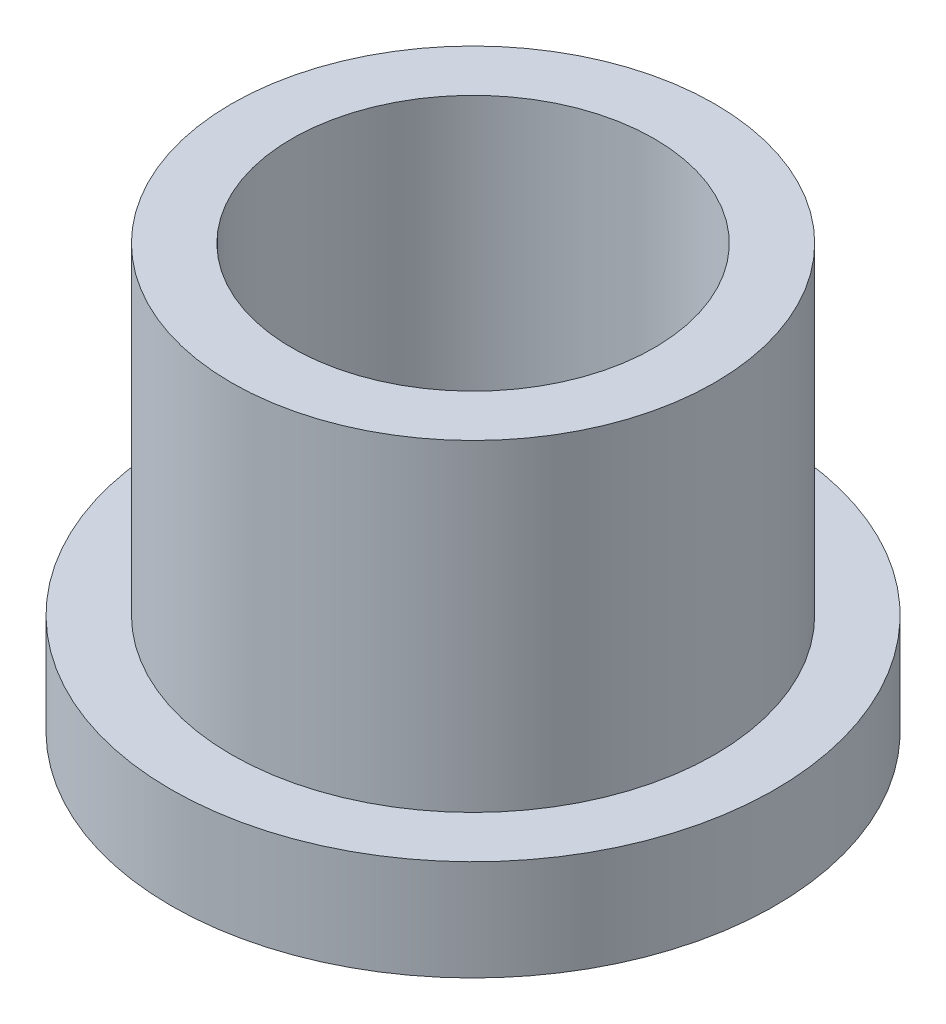
ISO-10303-21;
HEADER;
FILE_DESCRIPTION(('STEP AP214'),'2;1');
FILE_NAME('part.step','',(''),(''),'','','');
FILE_SCHEMA(('AUTOMOTIVE_DESIGN { 1 0 10303 214 1 1 1 1 }'));
ENDSEC;
DATA;
#1=APPLICATION_CONTEXT('core data for automotive mechanical design processes');
#2=APPLICATION_PROTOCOL_DEFINITION('international standard','automotive_design',2000,#1);
#3=PRODUCT_CONTEXT('',#1,'mechanical');
#4=PRODUCT('Part','Part','',(#3));
#5=PRODUCT_RELATED_PRODUCT_CATEGORY('part','',(#4));
#6=PRODUCT_DEFINITION_FORMATION('','',#4);
#7=PRODUCT_DEFINITION_CONTEXT('part definition',#1,'design');
#8=PRODUCT_DEFINITION('design','',#6,#7);
#9=PRODUCT_DEFINITION_SHAPE('','',#8);
#10=(LENGTH_UNIT() NAMED_UNIT(*) SI_UNIT(.MILLI.,.METRE.));
#11=(NAMED_UNIT(*) PLANE_ANGLE_UNIT() SI_UNIT($,.RADIAN.));
#12=(NAMED_UNIT(*) SI_UNIT($,.STERADIAN.) SOLID_ANGLE_UNIT());
#13=UNCERTAINTY_MEASURE_WITH_UNIT(LENGTH_MEASURE(1.E-05),#10,'distance_accuracy_value','');
#14=(GEOMETRIC_REPRESENTATION_CONTEXT(3) GLOBAL_UNCERTAINTY_ASSIGNED_CONTEXT((#13)) GLOBAL_UNIT_ASSIGNED_CONTEXT((#10,
#11,#12)) REPRESENTATION_CONTEXT('',''));
#15=CARTESIAN_POINT('',(0.,0.,0.));
#16=DIRECTION('',(0.,0.,1.));
#17=DIRECTION('',(1.,0.,0.));
#18=AXIS2_PLACEMENT_3D('',#15,#16,#17);
#19=CARTESIAN_POINT('',(0.,5.,0.));
#20=DIRECTION('',(0.,-1.,0.));
#21=DIRECTION('',(0.,0.,-1.));
#22=AXIS2_PLACEMENT_3D('',#19,#20,#21);
#23=CYLINDRICAL_SURFACE('',#22,15.);
#24=CARTESIAN_POINT('',(0.,5.,0.));
#25=DIRECTION('',(0.,1.,0.));
#26=DIRECTION('',(0.,0.,1.));
#27=AXIS2_PLACEMENT_3D('',#24,#25,#26);
#28=CIRCLE('',#27,15.);
#29=CARTESIAN_POINT('',(0.,5.,15.));
#30=VERTEX_POINT('',#29);
#31=EDGE_CURVE('E10',#30,#30,#28,.T.);
#32=ORIENTED_EDGE('',*,*,#31,.F.);
#33=EDGE_LOOP('',(#32));
#34=FACE_BOUND('',#33,.T.);
#35=CARTESIAN_POINT('',(0.,0.,0.));
#36=DIRECTION('',(0.,1.,0.));
#37=DIRECTION('',(0.,0.,1.));
#38=AXIS2_PLACEMENT_3D('',#35,#36,#37);
#39=CIRCLE('',#38,15.);
#40=CARTESIAN_POINT('',(0.,0.,15.));
#41=VERTEX_POINT('',#40);
#42=EDGE_CURVE('E38',#41,#41,#39,.T.);
#43=ORIENTED_EDGE('',*,*,#42,.T.);
#44=EDGE_LOOP('',(#43));
#45=FACE_BOUND('',#44,.T.);
#46=ADVANCED_FACE('F35',(#34,#45),#23,.T.);
#47=CARTESIAN_POINT('',(0.,5.,0.));
#48=DIRECTION('',(0.,1.,0.));
#49=DIRECTION('',(0.,0.,1.));
#50=AXIS2_PLACEMENT_3D('',#47,#48,#49);
#51=PLANE('',#50);
#52=CARTESIAN_POINT('',(0.,5.,0.));
#53=DIRECTION('',(0.,1.,0.));
#54=DIRECTION('',(0.,0.,1.));
#55=AXIS2_PLACEMENT_3D('',#52,#53,#54);
#56=CIRCLE('',#55,12.);
#57=CARTESIAN_POINT('',(0.,5.,-12.));
#58=VERTEX_POINT('',#57);
#59=EDGE_CURVE('E45',#58,#58,#56,.F.);
#60=ORIENTED_EDGE('',*,*,#59,.T.);
#61=EDGE_LOOP('',(#60));
#62=FACE_BOUND('',#61,.T.);
#63=ORIENTED_EDGE('',*,*,#31,.T.);
#64=EDGE_LOOP('',(#63));
#65=FACE_BOUND('',#64,.T.);
#66=ADVANCED_FACE('F76',(#62,#65),#51,.T.);
#67=CARTESIAN_POINT('',(0.,0.,0.));
#68=DIRECTION('',(0.,1.,0.));
#69=DIRECTION('',(0.,0.,1.));
#70=AXIS2_PLACEMENT_3D('',#67,#68,#69);
#71=PLANE('',#70);
#72=CARTESIAN_POINT('',(0.,0.,0.));
#73=DIRECTION('',(0.,1.,0.));
#74=DIRECTION('',(0.,0.,1.));
#75=AXIS2_PLACEMENT_3D('',#72,#73,#74);
#76=CIRCLE('',#75,9.);
#77=CARTESIAN_POINT('',(0.,0.,-9.));
#78=VERTEX_POINT('',#77);
#79=EDGE_CURVE('E53',#78,#78,#76,.T.);
#80=ORIENTED_EDGE('',*,*,#79,.T.);
#81=EDGE_LOOP('',(#80));
#82=FACE_BOUND('',#81,.T.);
#83=ORIENTED_EDGE('',*,*,#42,.F.);
#84=EDGE_LOOP('',(#83));
#85=FACE_BOUND('',#84,.T.);
#86=ADVANCED_FACE('F70',(#82,#85),#71,.F.);
#87=CARTESIAN_POINT('',(0.,21.,0.));
#88=DIRECTION('',(0.,-1.,0.));
#89=DIRECTION('',(0.,0.,-1.));
#90=AXIS2_PLACEMENT_3D('',#87,#88,#89);
#91=CYLINDRICAL_SURFACE('',#90,12.);
#92=CARTESIAN_POINT('',(0.,21.,0.));
#93=DIRECTION('',(0.,1.,0.));
#94=DIRECTION('',(0.,0.,1.));
#95=AXIS2_PLACEMENT_3D('',#92,#93,#94);
#96=CIRCLE('',#95,12.);
#97=CARTESIAN_POINT('',(0.,21.,-12.));
#98=VERTEX_POINT('',#97);
#99=EDGE_CURVE('E49',#98,#98,#96,.T.);
#100=CARTESIAN_POINT('',(0.,5.,-12.));
#101=CARTESIAN_POINT('',(0.,5.16666666666666,-12.));
#102=CARTESIAN_POINT('',(0.,5.33333333333333,-12.));
#103=CARTESIAN_POINT('',(0.,5.66666666666666,-12.));
#104=CARTESIAN_POINT('',(0.,5.83333333333333,-12.));
#105=CARTESIAN_POINT('',(0.,6.16666666666666,-12.));
#106=CARTESIAN_POINT('',(0.,6.33333333333333,-12.));
#107=CARTESIAN_POINT('',(0.,6.66666666666666,-12.));
#108=CARTESIAN_POINT('',(0.,6.83333333333333,-12.));
#109=CARTESIAN_POINT('',(0.,7.16666666666666,-12.));
#110=CARTESIAN_POINT('',(0.,7.33333333333333,-12.));
#111=CARTESIAN_POINT('',(0.,7.66666666666666,-12.));
#112=CARTESIAN_POINT('',(0.,7.83333333333333,-12.));
#113=CARTESIAN_POINT('',(0.,8.16666666666666,-12.));
#114=CARTESIAN_POINT('',(0.,8.33333333333333,-12.));
#115=CARTESIAN_POINT('',(0.,8.66666666666666,-12.));
#116=CARTESIAN_POINT('',(0.,8.83333333333333,-12.));
#117=CARTESIAN_POINT('',(0.,9.16666666666666,-12.));
#118=CARTESIAN_POINT('',(0.,9.33333333333333,-12.));
#119=CARTESIAN_POINT('',(0.,9.66666666666666,-12.));
#120=CARTESIAN_POINT('',(0.,9.83333333333333,-12.));
#121=CARTESIAN_POINT('',(0.,10.1666666666667,-12.));
#122=CARTESIAN_POINT('',(0.,10.3333333333333,-12.));
#123=CARTESIAN_POINT('',(0.,10.6666666666667,-12.));
#124=CARTESIAN_POINT('',(0.,10.8333333333333,-12.));
#125=CARTESIAN_POINT('',(0.,11.1666666666667,-12.));
#126=CARTESIAN_POINT('',(0.,11.3333333333333,-12.));
#127=CARTESIAN_POINT('',(0.,11.6666666666667,-12.));
#128=CARTESIAN_POINT('',(0.,11.8333333333333,-12.));
#129=CARTESIAN_POINT('',(0.,12.1666666666667,-12.));
#130=CARTESIAN_POINT('',(0.,12.3333333333333,-12.));
#131=CARTESIAN_POINT('',(0.,12.6666666666667,-12.));
#132=CARTESIAN_POINT('',(0.,12.8333333333333,-12.));
#133=CARTESIAN_POINT('',(0.,13.1666666666667,-12.));
#134=CARTESIAN_POINT('',(0.,13.3333333333333,-12.));
#135=CARTESIAN_POINT('',(0.,13.6666666666667,-12.));
#136=CARTESIAN_POINT('',(0.,13.8333333333333,-12.));
#137=CARTESIAN_POINT('',(0.,14.1666666666667,-12.));
#138=CARTESIAN_POINT('',(0.,14.3333333333333,-12.));
#139=CARTESIAN_POINT('',(0.,14.6666666666667,-12.));
#140=CARTESIAN_POINT('',(0.,14.8333333333333,-12.));
#141=CARTESIAN_POINT('',(0.,15.1666666666667,-12.));
#142=CARTESIAN_POINT('',(0.,15.3333333333333,-12.));
#143=CARTESIAN_POINT('',(0.,15.6666666666667,-12.));
#144=CARTESIAN_POINT('',(0.,15.8333333333333,-12.));
#145=CARTESIAN_POINT('',(0.,16.1666666666667,-12.));
#146=CARTESIAN_POINT('',(0.,16.3333333333333,-12.));
#147=CARTESIAN_POINT('',(0.,16.6666666666667,-12.));
#148=CARTESIAN_POINT('',(0.,16.8333333333333,-12.));
#149=CARTESIAN_POINT('',(0.,17.1666666666667,-12.));
#150=CARTESIAN_POINT('',(0.,17.3333333333333,-12.));
#151=CARTESIAN_POINT('',(0.,17.6666666666667,-12.));
#152=CARTESIAN_POINT('',(0.,17.8333333333333,-12.));
#153=CARTESIAN_POINT('',(0.,18.1666666666667,-12.));
#154=CARTESIAN_POINT('',(0.,18.3333333333333,-12.));
#155=CARTESIAN_POINT('',(0.,18.6666666666667,-12.));
#156=CARTESIAN_POINT('',(0.,18.8333333333333,-12.));
#157=CARTESIAN_POINT('',(0.,19.1666666666667,-12.));
#158=CARTESIAN_POINT('',(0.,19.3333333333333,-12.));
#159=CARTESIAN_POINT('',(0.,19.6666666666667,-12.));
#160=CARTESIAN_POINT('',(0.,19.8333333333333,-12.));
#161=CARTESIAN_POINT('',(0.,20.1666666666667,-12.));
#162=CARTESIAN_POINT('',(0.,20.3333333333333,-12.));
#163=CARTESIAN_POINT('',(0.,20.6666666666667,-12.));
#164=CARTESIAN_POINT('',(0.,20.8333333333333,-12.));
#165=CARTESIAN_POINT('',(0.,21.,-12.));
#166=B_SPLINE_CURVE_WITH_KNOTS('',3,(#100,#101,#102,#103,#104,#105,#106,#107,#108,#109,#110,
#111,#112,#113,#114,#115,#116,#117,#118,#119,#120,#121,#122,#123,#124,#125,#126,#127,#128,#129,
#130,#131,#132,#133,#134,#135,#136,#137,#138,#139,#140,#141,#142,#143,#144,#145,#146,#147,#148,
#149,#150,#151,#152,#153,#154,#155,#156,#157,#158,#159,#160,#161,#162,#163,#164,#165),
.UNSPECIFIED.,.F.,.F.,(4,2,2,2,2,2,2,2,2,2,2,2,2,2,2,2,2,2,2,2,2,2,2,2,2,2,2,2,2,2,2,2,4),(0.,
0.499999999999999,0.999999999999999,1.5,2.,2.5,3.,3.5,4.,4.5,5.,5.5,6.,6.5,7.,7.5,8.,8.5,9.,9.5,
10.,10.5,11.,11.5,12.,12.5,13.,13.5,14.,14.5,15.,15.5,16.),.UNSPECIFIED.);
#167=EDGE_CURVE('BSEAM65',#58,#98,#166,.T.);
#168=ORIENTED_EDGE('',*,*,#59,.F.);
#169=ORIENTED_EDGE('',*,*,#99,.F.);
#170=ORIENTED_EDGE('',*,*,#167,.T.);
#171=ORIENTED_EDGE('',*,*,#167,.F.);
#172=EDGE_LOOP('',(#168,#170,#169,#171));
#173=FACE_BOUND('',#172,.T.);
#174=ADVANCED_FACE('F65',(#173),#91,.T.);
#175=CARTESIAN_POINT('',(0.,21.,0.));
#176=DIRECTION('',(0.,1.,0.));
#177=DIRECTION('',(0.,0.,1.));
#178=AXIS2_PLACEMENT_3D('',#175,#176,#177);
#179=PLANE('',#178);
#180=CARTESIAN_POINT('',(0.,21.,0.));
#181=DIRECTION('',(0.,1.,0.));
#182=DIRECTION('',(0.,0.,1.));
#183=AXIS2_PLACEMENT_3D('',#180,#181,#182);
#184=CIRCLE('',#183,9.);
#185=CARTESIAN_POINT('',(0.,21.,-9.));
#186=VERTEX_POINT('',#185);
#187=EDGE_CURVE('E52',#186,#186,#184,.T.);
#188=ORIENTED_EDGE('',*,*,#187,.F.);
#189=EDGE_LOOP('',(#188));
#190=FACE_BOUND('',#189,.T.);
#191=ORIENTED_EDGE('',*,*,#99,.T.);
#192=EDGE_LOOP('',(#191));
#193=FACE_BOUND('',#192,.T.);
#194=ADVANCED_FACE('F62',(#190,#193),#179,.T.);
#195=CARTESIAN_POINT('',(0.,21.,0.));
#196=DIRECTION('',(0.,-1.,0.));
#197=DIRECTION('',(0.,0.,-1.));
#198=AXIS2_PLACEMENT_3D('',#195,#196,#197);
#199=CYLINDRICAL_SURFACE('',#198,9.);
#200=CARTESIAN_POINT('',(0.,21.,-9.));
#201=CARTESIAN_POINT('',(0.,20.78125,-9.));
#202=CARTESIAN_POINT('',(0.,20.5625,-9.));
#203=CARTESIAN_POINT('',(0.,20.125,-9.));
#204=CARTESIAN_POINT('',(0.,19.90625,-9.));
#205=CARTESIAN_POINT('',(0.,19.46875,-9.));
#206=CARTESIAN_POINT('',(0.,19.25,-9.));
#207=CARTESIAN_POINT('',(0.,18.8125,-9.));
#208=CARTESIAN_POINT('',(0.,18.59375,-9.));
#209=CARTESIAN_POINT('',(0.,18.15625,-9.));
#210=CARTESIAN_POINT('',(0.,17.9375,-9.));
#211=CARTESIAN_POINT('',(0.,17.5,-9.));
#212=CARTESIAN_POINT('',(0.,17.28125,-9.));
#213=CARTESIAN_POINT('',(0.,16.84375,-9.));
#214=CARTESIAN_POINT('',(0.,16.625,-9.));
#215=CARTESIAN_POINT('',(0.,16.1875,-9.));
#216=CARTESIAN_POINT('',(0.,15.96875,-9.));
#217=CARTESIAN_POINT('',(0.,15.53125,-9.));
#218=CARTESIAN_POINT('',(0.,15.3125,-9.));
#219=CARTESIAN_POINT('',(0.,14.875,-9.));
#220=CARTESIAN_POINT('',(0.,14.65625,-9.));
#221=CARTESIAN_POINT('',(0.,14.21875,-9.));
#222=CARTESIAN_POINT('',(0.,14.,-9.));
#223=CARTESIAN_POINT('',(0.,13.5625,-9.));
#224=CARTESIAN_POINT('',(0.,13.34375,-9.));
#225=CARTESIAN_POINT('',(0.,12.90625,-9.));
#226=CARTESIAN_POINT('',(0.,12.6875,-9.));
#227=CARTESIAN_POINT('',(0.,12.25,-9.));
#228=CARTESIAN_POINT('',(0.,12.03125,-9.));
#229=CARTESIAN_POINT('',(0.,11.59375,-9.));
#230=CARTESIAN_POINT('',(0.,11.375,-9.));
#231=CARTESIAN_POINT('',(0.,10.9375,-9.));
#232=CARTESIAN_POINT('',(0.,10.71875,-9.));
#233=CARTESIAN_POINT('',(0.,10.28125,-9.));
#234=CARTESIAN_POINT('',(0.,10.0625,-9.));
#235=CARTESIAN_POINT('',(0.,9.625,-9.));
#236=CARTESIAN_POINT('',(0.,9.40625,-9.));
#237=CARTESIAN_POINT('',(0.,8.96875,-9.));
#238=CARTESIAN_POINT('',(0.,8.75,-9.));
#239=CARTESIAN_POINT('',(0.,8.3125,-9.));
#240=CARTESIAN_POINT('',(0.,8.09375,-9.));
#241=CARTESIAN_POINT('',(0.,7.65625,-9.));
#242=CARTESIAN_POINT('',(0.,7.4375,-9.));
#243=CARTESIAN_POINT('',(0.,7.,-9.));
#244=CARTESIAN_POINT('',(0.,6.78125,-9.));
#245=CARTESIAN_POINT('',(0.,6.34375,-9.));
#246=CARTESIAN_POINT('',(0.,6.125,-9.));
#247=CARTESIAN_POINT('',(0.,5.6875,-9.));
#248=CARTESIAN_POINT('',(0.,5.46875,-9.));
#249=CARTESIAN_POINT('',(0.,5.03125,-9.));
#250=CARTESIAN_POINT('',(0.,4.8125,-9.));
#251=CARTESIAN_POINT('',(0.,4.375,-9.));
#252=CARTESIAN_POINT('',(0.,4.15625,-9.));
#253=CARTESIAN_POINT('',(0.,3.71875,-9.));
#254=CARTESIAN_POINT('',(0.,3.5,-9.));
#255=CARTESIAN_POINT('',(0.,3.0625,-9.));
#256=CARTESIAN_POINT('',(0.,2.84375,-9.));
#257=CARTESIAN_POINT('',(0.,2.40625,-9.));
#258=CARTESIAN_POINT('',(0.,2.1875,-9.));
#259=CARTESIAN_POINT('',(0.,1.75,-9.));
#260=CARTESIAN_POINT('',(0.,1.53125,-9.));
#261=CARTESIAN_POINT('',(0.,1.09375,-9.));
#262=CARTESIAN_POINT('',(0.,0.875000000000001,-9.));
#263=CARTESIAN_POINT('',(0.,0.4375,-9.));
#264=CARTESIAN_POINT('',(0.,0.21875,-9.));
#265=CARTESIAN_POINT('',(0.,0.,-9.));
#266=B_SPLINE_CURVE_WITH_KNOTS('',3,(#200,#201,#202,#203,#204,#205,#206,#207,#208,#209,#210,
#211,#212,#213,#214,#215,#216,#217,#218,#219,#220,#221,#222,#223,#224,#225,#226,#227,#228,#229,
#230,#231,#232,#233,#234,#235,#236,#237,#238,#239,#240,#241,#242,#243,#244,#245,#246,#247,#248,
#249,#250,#251,#252,#253,#254,#255,#256,#257,#258,#259,#260,#261,#262,#263,#264,#265),
.UNSPECIFIED.,.F.,.F.,(4,2,2,2,2,2,2,2,2,2,2,2,2,2,2,2,2,2,2,2,2,2,2,2,2,2,2,2,2,2,2,2,4),(0.,
0.656249999999997,1.3125,1.96875,2.625,3.28125,3.9375,4.59375,5.25,5.90625,6.5625,7.21875,7.875,
8.53125,9.1875,9.84375,10.5,11.15625,11.8125,12.46875,13.125,13.78125,14.4375,15.09375,15.75,
16.40625,17.0625,17.71875,18.375,19.03125,19.6875,20.34375,21.),.UNSPECIFIED.);
#267=EDGE_CURVE('BSEAM59',#186,#78,#266,.T.);
#268=ORIENTED_EDGE('',*,*,#187,.T.);
#269=ORIENTED_EDGE('',*,*,#79,.F.);
#270=ORIENTED_EDGE('',*,*,#267,.T.);
#271=ORIENTED_EDGE('',*,*,#267,.F.);
#272=EDGE_LOOP('',(#268,#270,#269,#271));
#273=FACE_BOUND('',#272,.T.);
#274=ADVANCED_FACE('F59',(#273),#199,.F.);
#275=CLOSED_SHELL('',(#46,#66,#86,#174,#194,#274));
#276=MANIFOLD_SOLID_BREP('B2',#275);
#277=ADVANCED_BREP_SHAPE_REPRESENTATION('',(#18,#276),#14);
#278=SHAPE_DEFINITION_REPRESENTATION(#9,#277);
ENDSEC;
END-ISO-10303-21;
